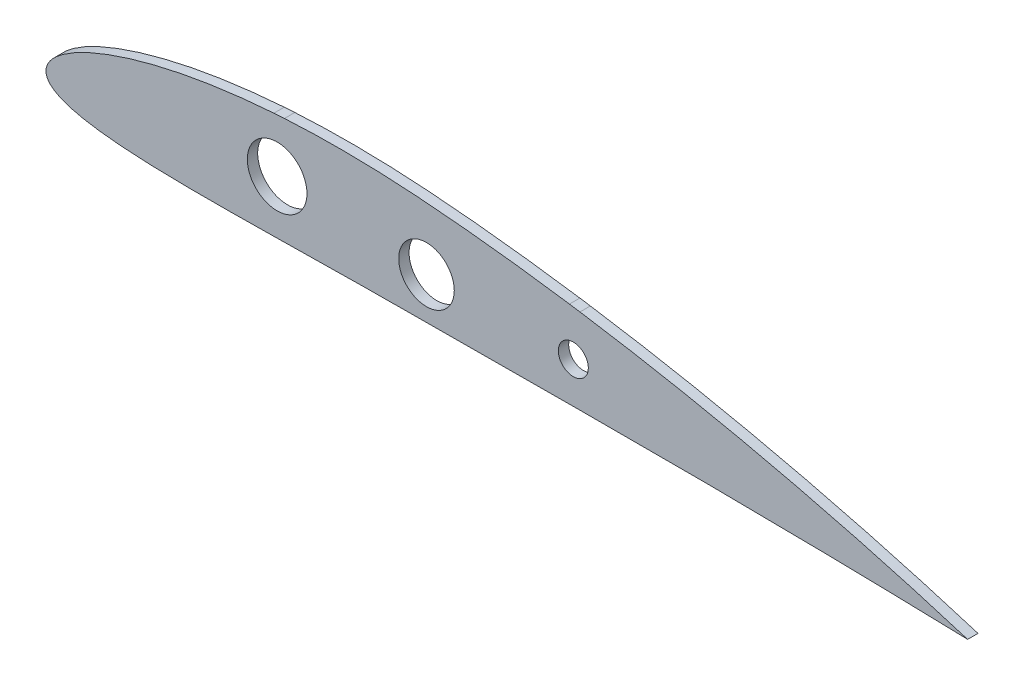
ISO-10303-21;
HEADER;
FILE_DESCRIPTION(('STEP AP214'),'2;1');
FILE_NAME('part.step','',(''),(''),'','','');
FILE_SCHEMA(('AUTOMOTIVE_DESIGN { 1 0 10303 214 1 1 1 1 }'));
ENDSEC;
DATA;
#1=APPLICATION_CONTEXT('core data for automotive mechanical design processes');
#2=APPLICATION_PROTOCOL_DEFINITION('international standard','automotive_design',2000,#1);
#3=PRODUCT_CONTEXT('',#1,'mechanical');
#4=PRODUCT('Part','Part','',(#3));
#5=PRODUCT_RELATED_PRODUCT_CATEGORY('part','',(#4));
#6=PRODUCT_DEFINITION_FORMATION('','',#4);
#7=PRODUCT_DEFINITION_CONTEXT('part definition',#1,'design');
#8=PRODUCT_DEFINITION('design','',#6,#7);
#9=PRODUCT_DEFINITION_SHAPE('','',#8);
#10=(LENGTH_UNIT() NAMED_UNIT(*) SI_UNIT(.MILLI.,.METRE.));
#11=(NAMED_UNIT(*) PLANE_ANGLE_UNIT() SI_UNIT($,.RADIAN.));
#12=(NAMED_UNIT(*) SI_UNIT($,.STERADIAN.) SOLID_ANGLE_UNIT());
#13=UNCERTAINTY_MEASURE_WITH_UNIT(LENGTH_MEASURE(1.E-05),#10,'distance_accuracy_value','');
#14=(GEOMETRIC_REPRESENTATION_CONTEXT(3) GLOBAL_UNCERTAINTY_ASSIGNED_CONTEXT((#13)) GLOBAL_UNIT_ASSIGNED_CONTEXT((#10,
#11,#12)) REPRESENTATION_CONTEXT('',''));
#15=CARTESIAN_POINT('',(0.,0.,0.));
#16=DIRECTION('',(0.,0.,1.));
#17=DIRECTION('',(1.,0.,0.));
#18=AXIS2_PLACEMENT_3D('',#15,#16,#17);
#19=CARTESIAN_POINT('',(149.894619256414,106.854755989877,1.4));
#20=CARTESIAN_POINT('',(158.680275082572,106.889957074756,1.4));
#21=CARTESIAN_POINT('',(176.251614136073,106.916321204518,1.4));
#22=CARTESIAN_POINT('',(202.609661936218,106.73064533298,1.4));
#23=CARTESIAN_POINT('',(228.96468105988,106.292568252224,1.4));
#24=CARTESIAN_POINT('',(246.530526636941,105.850587700062,1.4));
#25=CARTESIAN_POINT('',(255.312881654357,105.60676111473,1.4));
#26=B_SPLINE_CURVE_WITH_KNOTS('',3,(#19,#20,#21,#22,#23,#24,#25),.UNSPECIFIED.,.F.,.F.,(4,1,1,1,
4),(0.581490104405728,0.685469054372265,0.789448004338803,0.89342695430534,0.997405904271877),.UNSPECIFIED.);
#27=DIRECTION('',(0.,0.,-1.));
#28=VECTOR('',#27,1.);
#29=SURFACE_OF_LINEAR_EXTRUSION('',#26,#28);
#30=CARTESIAN_POINT('',(149.894619256414,106.854755989877,-1.4));
#31=CARTESIAN_POINT('',(158.680275082572,106.889957074756,-1.4));
#32=CARTESIAN_POINT('',(176.251614136073,106.916321204518,-1.4));
#33=CARTESIAN_POINT('',(202.609661936218,106.73064533298,-1.4));
#34=CARTESIAN_POINT('',(228.96468105988,106.292568252224,-1.4));
#35=CARTESIAN_POINT('',(246.530526636941,105.850587700062,-1.4));
#36=CARTESIAN_POINT('',(255.312881654357,105.60676111473,-1.4));
#37=B_SPLINE_CURVE_WITH_KNOTS('',3,(#30,#31,#32,#33,#34,#35,#36),.UNSPECIFIED.,.F.,.F.,(4,1,1,1,
4),(0.581490104405728,0.685469054372265,0.789448004338803,0.89342695430534,0.997405904271877),.UNSPECIFIED.);
#38=CARTESIAN_POINT('',(149.894619256414,106.854755989877,-1.4));
#39=VERTEX_POINT('',#38);
#40=CARTESIAN_POINT('',(255.312881654357,105.60676111473,-1.4));
#41=VERTEX_POINT('',#40);
#42=EDGE_CURVE('E299',#39,#41,#37,.T.);
#43=ORIENTED_EDGE('',*,*,#42,.T.);
#44=DIRECTION('',(0.,0.,-1.));
#45=VECTOR('',#44,1.);
#46=CARTESIAN_POINT('',(255.312881654357,105.60676111473,1.4));
#47=LINE('',#46,#45);
#48=CARTESIAN_POINT('',(255.312881654357,105.60676111473,1.4));
#49=VERTEX_POINT('',#48);
#50=EDGE_CURVE('E11',#49,#41,#47,.T.);
#51=ORIENTED_EDGE('',*,*,#50,.F.);
#52=CARTESIAN_POINT('',(149.894619256414,106.854755989877,1.4));
#53=VERTEX_POINT('',#52);
#54=EDGE_CURVE('E226',#53,#49,#26,.T.);
#55=ORIENTED_EDGE('',*,*,#54,.F.);
#56=DIRECTION('',(0.,0.,-1.));
#57=VECTOR('',#56,1.);
#58=CARTESIAN_POINT('',(149.894619256414,106.854755989877,1.4));
#59=LINE('',#58,#57);
#60=EDGE_CURVE('E151',#53,#39,#59,.T.);
#61=ORIENTED_EDGE('',*,*,#60,.T.);
#62=EDGE_LOOP('',(#43,#51,#55,#61));
#63=FACE_BOUND('',#62,.T.);
#64=ADVANCED_FACE('F41',(#63),#29,.F.);
#65=CARTESIAN_POINT('',(255.312881654358,105.60676111473,1.4));
#66=CARTESIAN_POINT('',(246.756257413019,108.260896884076,1.4));
#67=CARTESIAN_POINT('',(229.544442336783,113.256971155101,1.4));
#68=CARTESIAN_POINT('',(203.470240893226,119.799788090141,1.4));
#69=CARTESIAN_POINT('',(177.178570900213,125.404416996228,1.4));
#70=CARTESIAN_POINT('',(159.522198848418,128.478032217995,1.4));
#71=CARTESIAN_POINT('',(150.666396797967,129.829620390135,1.4));
#72=B_SPLINE_CURVE_WITH_KNOTS('',3,(#65,#66,#67,#68,#69,#70,#71),.UNSPECIFIED.,.F.,.F.,(4,1,1,1,
4),(0.00222757964376328,0.106325046268371,0.210422512892978,0.314519979517586,
0.418617446142193),.UNSPECIFIED.);
#73=DIRECTION('',(0.,0.,-1.));
#74=VECTOR('',#73,1.);
#75=SURFACE_OF_LINEAR_EXTRUSION('',#72,#74);
#76=CARTESIAN_POINT('',(255.312881654358,105.60676111473,-1.4));
#77=CARTESIAN_POINT('',(246.756257413019,108.260896884076,-1.4));
#78=CARTESIAN_POINT('',(229.544442336783,113.256971155101,-1.4));
#79=CARTESIAN_POINT('',(203.470240893226,119.799788090141,-1.4));
#80=CARTESIAN_POINT('',(177.178570900213,125.404416996228,-1.4));
#81=CARTESIAN_POINT('',(159.522198848418,128.478032217995,-1.4));
#82=CARTESIAN_POINT('',(150.666396797967,129.829620390135,-1.4));
#83=B_SPLINE_CURVE_WITH_KNOTS('',3,(#76,#77,#78,#79,#80,#81,#82),.UNSPECIFIED.,.F.,.F.,(4,1,1,1,
4),(0.00222757964376328,0.106325046268371,0.210422512892978,0.314519979517586,
0.418617446142193),.UNSPECIFIED.);
#84=CARTESIAN_POINT('',(150.666396797967,129.829620390135,-1.4));
#85=VERTEX_POINT('',#84);
#86=EDGE_CURVE('E290',#41,#85,#83,.T.);
#87=ORIENTED_EDGE('',*,*,#86,.T.);
#88=DIRECTION('',(0.,0.,-1.));
#89=VECTOR('',#88,1.);
#90=CARTESIAN_POINT('',(150.666396797967,129.829620390135,1.4));
#91=LINE('',#90,#89);
#92=CARTESIAN_POINT('',(150.666396797967,129.829620390135,1.4));
#93=VERTEX_POINT('',#92);
#94=EDGE_CURVE('E51',#93,#85,#91,.T.);
#95=ORIENTED_EDGE('',*,*,#94,.F.);
#96=EDGE_CURVE('E108',#49,#93,#72,.T.);
#97=ORIENTED_EDGE('',*,*,#96,.F.);
#98=ORIENTED_EDGE('',*,*,#50,.T.);
#99=EDGE_LOOP('',(#87,#95,#97,#98));
#100=FACE_BOUND('',#99,.T.);
#101=ADVANCED_FACE('F216',(#100),#75,.F.);
#102=CARTESIAN_POINT('',(22.4132301607214,149.108042258836,1.4));
#103=DIRECTION('',(-0.148645447229902,-0.988890555631826,0.));
#104=DIRECTION('',(0.988890555631826,-0.148645447229902,0.));
#105=AXIS2_PLACEMENT_3D('',#102,#103,#104);
#106=PLANE('',#105);
#107=DIRECTION('',(-0.988890555631827,0.148645447229902,0.));
#108=VECTOR('',#107,1.);
#109=CARTESIAN_POINT('',(22.4132301607214,149.108042258836,-1.4));
#110=LINE('',#109,#108);
#111=CARTESIAN_POINT('',(147.830444308927,130.255907630574,-1.4));
#112=VERTEX_POINT('',#111);
#113=EDGE_CURVE('E285',#85,#112,#110,.T.);
#114=ORIENTED_EDGE('',*,*,#113,.T.);
#115=DIRECTION('',(0.,0.,-1.));
#116=VECTOR('',#115,1.);
#117=CARTESIAN_POINT('',(147.830444308927,130.255907630574,1.4));
#118=LINE('',#117,#116);
#119=CARTESIAN_POINT('',(147.830444308927,130.255907630574,1.4));
#120=VERTEX_POINT('',#119);
#121=EDGE_CURVE('E277',#120,#112,#118,.T.);
#122=ORIENTED_EDGE('',*,*,#121,.F.);
#123=DIRECTION('',(-0.988890555631827,0.148645447229902,0.));
#124=VECTOR('',#123,1.);
#125=CARTESIAN_POINT('',(22.4132301607214,149.108042258836,1.4));
#126=LINE('',#125,#124);
#127=EDGE_CURVE('E202',#93,#120,#126,.T.);
#128=ORIENTED_EDGE('',*,*,#127,.F.);
#129=ORIENTED_EDGE('',*,*,#94,.T.);
#130=EDGE_LOOP('',(#114,#122,#128,#129));
#131=FACE_BOUND('',#130,.T.);
#132=ADVANCED_FACE('F212',(#131),#106,.F.);
#133=CARTESIAN_POINT('',(147.830444308927,130.255907630574,1.4));
#134=CARTESIAN_POINT('',(141.461413304013,131.198524365854,1.4));
#135=CARTESIAN_POINT('',(128.693359955302,132.886388705287,1.4));
#136=CARTESIAN_POINT('',(112.670431319553,134.461645248722,1.4));
#137=CARTESIAN_POINT('',(99.8269687406425,135.315000174993,1.4));
#138=CARTESIAN_POINT('',(86.9640203559575,135.731264376099,1.4));
#139=CARTESIAN_POINT('',(77.308341909027,135.549477481378,1.4));
#140=CARTESIAN_POINT('',(70.8877326550715,135.171040435875,1.4));
#141=B_SPLINE_CURVE_WITH_KNOTS('',3,(#133,#134,#135,#136,#137,#138,#139,#140),.UNSPECIFIED.,.F.,
.F.,(4,1,1,1,1,4),(0.429725304294292,0.504544930385916,0.57936455647754,0.616774369523352,
0.654184182569164,0.729003808660788),.UNSPECIFIED.);
#142=DIRECTION('',(0.,0.,-1.));
#143=VECTOR('',#142,1.);
#144=SURFACE_OF_LINEAR_EXTRUSION('',#141,#143);
#145=CARTESIAN_POINT('',(147.830444308927,130.255907630574,-1.4));
#146=CARTESIAN_POINT('',(141.461413304013,131.198524365854,-1.4));
#147=CARTESIAN_POINT('',(128.693359955302,132.886388705287,-1.4));
#148=CARTESIAN_POINT('',(112.670431319553,134.461645248722,-1.4));
#149=CARTESIAN_POINT('',(99.8269687406425,135.315000174993,-1.4));
#150=CARTESIAN_POINT('',(86.9640203559575,135.731264376099,-1.4));
#151=CARTESIAN_POINT('',(77.308341909027,135.549477481378,-1.4));
#152=CARTESIAN_POINT('',(70.8877326550715,135.171040435875,-1.4));
#153=B_SPLINE_CURVE_WITH_KNOTS('',3,(#145,#146,#147,#148,#149,#150,#151,#152),.UNSPECIFIED.,.F.,
.F.,(4,1,1,1,1,4),(0.429725304294292,0.504544930385916,0.57936455647754,0.616774369523352,
0.654184182569164,0.729003808660788),.UNSPECIFIED.);
#154=CARTESIAN_POINT('',(70.8877326550715,135.171040435875,-1.4));
#155=VERTEX_POINT('',#154);
#156=EDGE_CURVE('E292',#112,#155,#153,.T.);
#157=ORIENTED_EDGE('',*,*,#156,.T.);
#158=DIRECTION('',(0.,0.,-1.));
#159=VECTOR('',#158,1.);
#160=CARTESIAN_POINT('',(70.8877326550715,135.171040435875,1.4));
#161=LINE('',#160,#159);
#162=CARTESIAN_POINT('',(70.8877326550715,135.171040435875,1.4));
#163=VERTEX_POINT('',#162);
#164=EDGE_CURVE('E273',#163,#155,#161,.T.);
#165=ORIENTED_EDGE('',*,*,#164,.F.);
#166=EDGE_CURVE('E196',#120,#163,#141,.T.);
#167=ORIENTED_EDGE('',*,*,#166,.F.);
#168=ORIENTED_EDGE('',*,*,#121,.T.);
#169=EDGE_LOOP('',(#157,#165,#167,#168));
#170=FACE_BOUND('',#169,.T.);
#171=ADVANCED_FACE('F208',(#170),#144,.F.);
#172=CARTESIAN_POINT('',(-8.44678797017762,130.016927928256,1.4));
#173=DIRECTION('',(0.06483016250442,-0.99789631226378,0.));
#174=DIRECTION('',(0.99789631226378,0.06483016250442,0.));
#175=AXIS2_PLACEMENT_3D('',#172,#173,#174);
#176=PLANE('',#175);
#177=DIRECTION('',(-0.99789631226378,-0.06483016250442,0.));
#178=VECTOR('',#177,1.);
#179=CARTESIAN_POINT('',(-8.44678797017762,130.016927928256,-1.4));
#180=LINE('',#179,#178);
#181=CARTESIAN_POINT('',(68.0343243508861,134.985663536714,-1.4));
#182=VERTEX_POINT('',#181);
#183=EDGE_CURVE('E297',#155,#182,#180,.T.);
#184=ORIENTED_EDGE('',*,*,#183,.T.);
#185=DIRECTION('',(0.,0.,-1.));
#186=VECTOR('',#185,1.);
#187=CARTESIAN_POINT('',(68.0343243508861,134.985663536714,1.4));
#188=LINE('',#187,#186);
#189=CARTESIAN_POINT('',(68.0343243508861,134.985663536714,1.4));
#190=VERTEX_POINT('',#189);
#191=EDGE_CURVE('E269',#190,#182,#188,.T.);
#192=ORIENTED_EDGE('',*,*,#191,.F.);
#193=DIRECTION('',(-0.99789631226378,-0.06483016250442,0.));
#194=VECTOR('',#193,1.);
#195=CARTESIAN_POINT('',(-8.44678797017762,130.016927928256,1.4));
#196=LINE('',#195,#194);
#197=EDGE_CURVE('E190',#163,#190,#196,.T.);
#198=ORIENTED_EDGE('',*,*,#197,.F.);
#199=ORIENTED_EDGE('',*,*,#164,.T.);
#200=EDGE_LOOP('',(#184,#192,#198,#199));
#201=FACE_BOUND('',#200,.T.);
#202=ADVANCED_FACE('F211',(#201),#176,.F.);
#203=CARTESIAN_POINT('',(68.0343243508861,134.985663536714,1.4));
#204=CARTESIAN_POINT('',(62.4663272915128,134.590052618776,1.4));
#205=CARTESIAN_POINT('',(54.1287667732198,133.700155230356,1.4));
#206=CARTESIAN_POINT('',(43.125220572952,131.802909903816,1.4));
#207=CARTESIAN_POINT('',(34.9537761482906,129.977054103772,1.4));
#208=CARTESIAN_POINT('',(26.9071914758097,127.675989274361,1.4));
#209=CARTESIAN_POINT('',(20.3679809041667,125.262128548987,1.4));
#210=CARTESIAN_POINT('',(15.3365499347751,122.888373262699,1.4));
#211=CARTESIAN_POINT('',(11.7395607910426,120.808049658938,1.4));
#212=CARTESIAN_POINT('',(8.99153245879158,118.69641057424,1.4));
#213=CARTESIAN_POINT('',(7.48174934294299,116.88622792471,1.4));
#214=CARTESIAN_POINT('',(6.915411804354,115.858161553268,1.4));
#215=CARTESIAN_POINT('',(6.7078970409493,115.274334725607,1.4));
#216=CARTESIAN_POINT('',(6.62545754213481,114.936901914895,1.4));
#217=CARTESIAN_POINT('',(6.58542850054553,114.772902260157,1.4));
#218=B_SPLINE_CURVE_WITH_KNOTS('',3,(#203,#204,#205,#206,#207,#208,#209,#210,#211,#212,#213,
#214,#215,#216,#217),.UNSPECIFIED.,.F.,.F.,(4,1,1,1,1,1,1,1,1,1,1,1,4),(0.740090669371658,
0.805048089327921,0.837526799306053,0.870005509284185,0.902484219262317,0.934962929240448,
0.951202284229514,0.96744163921858,0.983680994207646,0.991800671702179,0.995860510449445,
0.997890429823078,0.999920349196711),.UNSPECIFIED.);
#219=DIRECTION('',(0.,0.,-1.));
#220=VECTOR('',#219,1.);
#221=SURFACE_OF_LINEAR_EXTRUSION('',#218,#220);
#222=CARTESIAN_POINT('',(68.0343243508861,134.985663536714,-1.4));
#223=CARTESIAN_POINT('',(62.4663272915128,134.590052618776,-1.4));
#224=CARTESIAN_POINT('',(54.1287667732198,133.700155230356,-1.4));
#225=CARTESIAN_POINT('',(43.125220572952,131.802909903816,-1.4));
#226=CARTESIAN_POINT('',(34.9537761482906,129.977054103772,-1.4));
#227=CARTESIAN_POINT('',(26.9071914758097,127.675989274361,-1.4));
#228=CARTESIAN_POINT('',(20.3679809041667,125.262128548987,-1.4));
#229=CARTESIAN_POINT('',(15.3365499347751,122.888373262699,-1.4));
#230=CARTESIAN_POINT('',(11.7395607910426,120.808049658938,-1.4));
#231=CARTESIAN_POINT('',(8.99153245879158,118.69641057424,-1.4));
#232=CARTESIAN_POINT('',(7.48174934294299,116.88622792471,-1.4));
#233=CARTESIAN_POINT('',(6.915411804354,115.858161553268,-1.4));
#234=CARTESIAN_POINT('',(6.7078970409493,115.274334725607,-1.4));
#235=CARTESIAN_POINT('',(6.62545754213481,114.936901914895,-1.4));
#236=CARTESIAN_POINT('',(6.58542850054553,114.772902260157,-1.4));
#237=B_SPLINE_CURVE_WITH_KNOTS('',3,(#222,#223,#224,#225,#226,#227,#228,#229,#230,#231,#232,
#233,#234,#235,#236),.UNSPECIFIED.,.F.,.F.,(4,1,1,1,1,1,1,1,1,1,1,1,4),(0.740090669371658,
0.805048089327921,0.837526799306053,0.870005509284185,0.902484219262317,0.934962929240448,
0.951202284229514,0.96744163921858,0.983680994207646,0.991800671702179,0.995860510449445,
0.997890429823078,0.999920349196711),.UNSPECIFIED.);
#238=CARTESIAN_POINT('',(6.58542850054553,114.772902260157,-1.4));
#239=VERTEX_POINT('',#238);
#240=EDGE_CURVE('E312',#182,#239,#237,.T.);
#241=ORIENTED_EDGE('',*,*,#240,.T.);
#242=DIRECTION('',(0.,0.,-1.));
#243=VECTOR('',#242,1.);
#244=CARTESIAN_POINT('',(6.58542850054553,114.772902260157,1.4));
#245=LINE('',#244,#243);
#246=CARTESIAN_POINT('',(6.58542850054553,114.772902260157,1.4));
#247=VERTEX_POINT('',#246);
#248=EDGE_CURVE('E265',#247,#239,#245,.T.);
#249=ORIENTED_EDGE('',*,*,#248,.F.);
#250=EDGE_CURVE('E181',#190,#247,#218,.T.);
#251=ORIENTED_EDGE('',*,*,#250,.F.);
#252=ORIENTED_EDGE('',*,*,#191,.T.);
#253=EDGE_LOOP('',(#241,#249,#251,#252));
#254=FACE_BOUND('',#253,.T.);
#255=ADVANCED_FACE('F173',(#254),#221,.F.);
#256=CARTESIAN_POINT('',(6.58542850054553,114.772902260157,1.4));
#257=CARTESIAN_POINT('',(6.56366414620477,114.614273347557,1.4));
#258=CARTESIAN_POINT('',(6.5190093469714,114.285406452402,1.4));
#259=CARTESIAN_POINT('',(6.51479072954578,113.710879009962,1.4));
#260=CARTESIAN_POINT('',(6.74189878291116,112.661535218991,1.4));
#261=CARTESIAN_POINT('',(7.66018429255603,111.409854012936,1.4));
#262=CARTESIAN_POINT('',(9.25908473021288,110.308268876171,1.4));
#263=CARTESIAN_POINT('',(11.044608156902,109.487380203342,1.4));
#264=CARTESIAN_POINT('',(12.9221944408203,108.850067693768,1.4));
#265=CARTESIAN_POINT('',(15.4901264572917,108.172753601497,1.4));
#266=CARTESIAN_POINT('',(18.7685029621804,107.558568006788,1.4));
#267=CARTESIAN_POINT('',(22.7454433758667,107.043168293996,1.4));
#268=CARTESIAN_POINT('',(28.0773130031014,106.557350361525,1.4));
#269=CARTESIAN_POINT('',(34.769590400056,106.213470374942,1.4));
#270=CARTESIAN_POINT('',(42.813490810935,106.037235573254,1.4));
#271=CARTESIAN_POINT('',(50.8626774800394,106.006056339145,1.4));
#272=CARTESIAN_POINT('',(58.9136155720875,106.062256394151,1.4));
#273=CARTESIAN_POINT('',(64.2820421930946,106.132538160557,1.4));
#274=CARTESIAN_POINT('',(66.9660117195889,106.171159396513,1.4));
#275=B_SPLINE_CURVE_WITH_KNOTS('',3,(#256,#257,#258,#259,#260,#261,#262,#263,#264,#265,#266,
#267,#268,#269,#270,#271,#272,#273,#274),.UNSPECIFIED.,.F.,.F.,(4,1,1,1,1,1,1,1,1,1,1,1,1,1,1,1,
4),(8.11675194704331E-05,0.00206730045466935,0.00405343338986826,0.00802569926026608,
0.0159702310010617,0.0239147627418574,0.031859294482653,0.0398038262234487,0.0477483579642443,
0.0636374214458356,0.0795264849274269,0.0954155484090183,0.127193675372201,0.158971802335383,
0.190749929298566,0.222528056261749,0.254306183224931),.UNSPECIFIED.);
#276=DIRECTION('',(0.,0.,-1.));
#277=VECTOR('',#276,1.);
#278=SURFACE_OF_LINEAR_EXTRUSION('',#275,#277);
#279=CARTESIAN_POINT('',(6.58542850054553,114.772902260157,-1.4));
#280=CARTESIAN_POINT('',(6.56366414620477,114.614273347557,-1.4));
#281=CARTESIAN_POINT('',(6.5190093469714,114.285406452402,-1.4));
#282=CARTESIAN_POINT('',(6.51479072954578,113.710879009962,-1.4));
#283=CARTESIAN_POINT('',(6.74189878291116,112.661535218991,-1.4));
#284=CARTESIAN_POINT('',(7.66018429255603,111.409854012936,-1.4));
#285=CARTESIAN_POINT('',(9.25908473021288,110.308268876171,-1.4));
#286=CARTESIAN_POINT('',(11.044608156902,109.487380203342,-1.4));
#287=CARTESIAN_POINT('',(12.9221944408203,108.850067693768,-1.4));
#288=CARTESIAN_POINT('',(15.4901264572917,108.172753601497,-1.4));
#289=CARTESIAN_POINT('',(18.7685029621804,107.558568006788,-1.4));
#290=CARTESIAN_POINT('',(22.7454433758667,107.043168293996,-1.4));
#291=CARTESIAN_POINT('',(28.0773130031014,106.557350361525,-1.4));
#292=CARTESIAN_POINT('',(34.769590400056,106.213470374942,-1.4));
#293=CARTESIAN_POINT('',(42.813490810935,106.037235573254,-1.4));
#294=CARTESIAN_POINT('',(50.8626774800394,106.006056339145,-1.4));
#295=CARTESIAN_POINT('',(58.9136155720875,106.062256394151,-1.4));
#296=CARTESIAN_POINT('',(64.2820421930946,106.132538160557,-1.4));
#297=CARTESIAN_POINT('',(66.9660117195889,106.171159396513,-1.4));
#298=B_SPLINE_CURVE_WITH_KNOTS('',3,(#279,#280,#281,#282,#283,#284,#285,#286,#287,#288,#289,
#290,#291,#292,#293,#294,#295,#296,#297),.UNSPECIFIED.,.F.,.F.,(4,1,1,1,1,1,1,1,1,1,1,1,1,1,1,1,
4),(8.11675194704331E-05,0.00206730045466935,0.00405343338986826,0.00802569926026608,
0.0159702310010617,0.0239147627418574,0.031859294482653,0.0398038262234487,0.0477483579642443,
0.0636374214458356,0.0795264849274269,0.0954155484090183,0.127193675372201,0.158971802335383,
0.190749929298566,0.222528056261749,0.254306183224931),.UNSPECIFIED.);
#299=CARTESIAN_POINT('',(66.9660117195889,106.171159396513,-1.4));
#300=VERTEX_POINT('',#299);
#301=EDGE_CURVE('E317',#239,#300,#298,.T.);
#302=ORIENTED_EDGE('',*,*,#301,.T.);
#303=DIRECTION('',(0.,0.,-1.));
#304=VECTOR('',#303,1.);
#305=CARTESIAN_POINT('',(66.9660117195889,106.171159396513,1.4));
#306=LINE('',#305,#304);
#307=CARTESIAN_POINT('',(66.9660117195889,106.171159396513,1.4));
#308=VERTEX_POINT('',#307);
#309=EDGE_CURVE('E144',#308,#300,#306,.T.);
#310=ORIENTED_EDGE('',*,*,#309,.F.);
#311=EDGE_CURVE('E133',#247,#308,#275,.T.);
#312=ORIENTED_EDGE('',*,*,#311,.F.);
#313=ORIENTED_EDGE('',*,*,#248,.T.);
#314=EDGE_LOOP('',(#302,#310,#312,#313));
#315=FACE_BOUND('',#314,.T.);
#316=ADVANCED_FACE('F170',(#315),#278,.F.);
#317=CARTESIAN_POINT('',(-1.55725848249838,105.156400011837,1.4));
#318=DIRECTION('',(-0.0148073512648334,0.999890365164361,0.));
#319=DIRECTION('',(-0.999890365164361,-0.0148073512648334,0.));
#320=AXIS2_PLACEMENT_3D('',#317,#318,#319);
#321=PLANE('',#320);
#322=DIRECTION('',(0.999890365164361,0.0148073512648334,0.));
#323=VECTOR('',#322,1.);
#324=CARTESIAN_POINT('',(-1.55725848249838,105.156400011837,-1.4));
#325=LINE('',#324,#323);
#326=CARTESIAN_POINT('',(69.8190690071352,106.213410250114,-1.4));
#327=VERTEX_POINT('',#326);
#328=EDGE_CURVE('E142',#300,#327,#325,.T.);
#329=ORIENTED_EDGE('',*,*,#328,.T.);
#330=DIRECTION('',(0.,0.,-1.));
#331=VECTOR('',#330,1.);
#332=CARTESIAN_POINT('',(69.8190690071352,106.213410250114,1.4));
#333=LINE('',#332,#331);
#334=CARTESIAN_POINT('',(69.8190690071352,106.213410250114,1.4));
#335=VERTEX_POINT('',#334);
#336=EDGE_CURVE('E139',#335,#327,#333,.T.);
#337=ORIENTED_EDGE('',*,*,#336,.F.);
#338=DIRECTION('',(0.999890365164361,0.0148073512648334,0.));
#339=VECTOR('',#338,1.);
#340=CARTESIAN_POINT('',(-1.55725848249838,105.156400011837,1.4));
#341=LINE('',#340,#339);
#342=EDGE_CURVE('E127',#308,#335,#341,.T.);
#343=ORIENTED_EDGE('',*,*,#342,.F.);
#344=ORIENTED_EDGE('',*,*,#309,.T.);
#345=EDGE_LOOP('',(#329,#337,#343,#344));
#346=FACE_BOUND('',#345,.T.);
#347=ADVANCED_FACE('F140',(#346),#321,.F.);
#348=CARTESIAN_POINT('',(69.8190690071352,106.213410250114,1.4));
#349=CARTESIAN_POINT('',(76.2538567327048,106.31100684137,1.4));
#350=CARTESIAN_POINT('',(85.9047948489214,106.47213737338,1.4));
#351=CARTESIAN_POINT('',(98.7779456737836,106.610759511662,1.4));
#352=CARTESIAN_POINT('',(111.651100899515,106.649514986469,1.4));
#353=CARTESIAN_POINT('',(127.735402572152,106.732475133212,1.4));
#354=CARTESIAN_POINT('',(140.606952956768,106.813706415112,1.4));
#355=CARTESIAN_POINT('',(147.042263767006,106.842620089855,1.4));
#356=B_SPLINE_CURVE_WITH_KNOTS('',3,(#348,#349,#350,#351,#352,#353,#354,#355),.UNSPECIFIED.,.F.,
.F.,(4,1,1,1,1,4),(0.265565078046195,0.341733084566208,0.379817087826214,0.41790109108622,
0.494069097606233,0.570237104126246),.UNSPECIFIED.);
#357=DIRECTION('',(0.,0.,-1.));
#358=VECTOR('',#357,1.);
#359=SURFACE_OF_LINEAR_EXTRUSION('',#356,#358);
#360=CARTESIAN_POINT('',(69.8190690071352,106.213410250114,-1.4));
#361=CARTESIAN_POINT('',(76.2538567327048,106.31100684137,-1.4));
#362=CARTESIAN_POINT('',(85.9047948489214,106.47213737338,-1.4));
#363=CARTESIAN_POINT('',(98.7779456737836,106.610759511662,-1.4));
#364=CARTESIAN_POINT('',(111.651100899515,106.649514986469,-1.4));
#365=CARTESIAN_POINT('',(127.735402572152,106.732475133212,-1.4));
#366=CARTESIAN_POINT('',(140.606952956768,106.813706415112,-1.4));
#367=CARTESIAN_POINT('',(147.042263767006,106.842620089855,-1.4));
#368=B_SPLINE_CURVE_WITH_KNOTS('',3,(#360,#361,#362,#363,#364,#365,#366,#367),.UNSPECIFIED.,.F.,
.F.,(4,1,1,1,1,4),(0.265565078046195,0.341733084566208,0.379817087826214,0.41790109108622,
0.494069097606233,0.570237104126246),.UNSPECIFIED.);
#369=CARTESIAN_POINT('',(147.042263767006,106.842620089855,-1.4));
#370=VERTEX_POINT('',#369);
#371=EDGE_CURVE('E94',#327,#370,#368,.T.);
#372=ORIENTED_EDGE('',*,*,#371,.T.);
#373=DIRECTION('',(0.,0.,-1.));
#374=VECTOR('',#373,1.);
#375=CARTESIAN_POINT('',(147.042263767006,106.842620089855,1.4));
#376=LINE('',#375,#374);
#377=CARTESIAN_POINT('',(147.042263767006,106.842620089855,1.4));
#378=VERTEX_POINT('',#377);
#379=EDGE_CURVE('E145',#378,#370,#376,.T.);
#380=ORIENTED_EDGE('',*,*,#379,.F.);
#381=EDGE_CURVE('E131',#335,#378,#356,.T.);
#382=ORIENTED_EDGE('',*,*,#381,.F.);
#383=ORIENTED_EDGE('',*,*,#336,.T.);
#384=EDGE_LOOP('',(#372,#380,#382,#383));
#385=FACE_BOUND('',#384,.T.);
#386=ADVANCED_FACE('F147',(#385),#359,.F.);
#387=CARTESIAN_POINT('',(68.9168426026147,120.636945020621,1.4));
#388=DIRECTION('',(0.,0.,-1.));
#389=DIRECTION('',(-1.,0.,0.));
#390=AXIS2_PLACEMENT_3D('',#387,#388,#389);
#391=CYLINDRICAL_SURFACE('',#390,8.05);
#392=CARTESIAN_POINT('',(68.9168426026147,120.636945020621,1.4));
#393=DIRECTION('',(0.,0.,1.));
#394=DIRECTION('',(1.,0.,0.));
#395=AXIS2_PLACEMENT_3D('',#392,#393,#394);
#396=CIRCLE('',#395,8.05);
#397=CARTESIAN_POINT('',(76.9668426026146,120.636945020621,1.4));
#398=VERTEX_POINT('',#397);
#399=EDGE_CURVE('E235',#398,#398,#396,.T.);
#400=ORIENTED_EDGE('',*,*,#399,.T.);
#401=EDGE_LOOP('',(#400));
#402=FACE_BOUND('',#401,.T.);
#403=CARTESIAN_POINT('',(68.9168426026147,120.636945020621,-1.4));
#404=DIRECTION('',(0.,0.,1.));
#405=DIRECTION('',(1.,0.,0.));
#406=AXIS2_PLACEMENT_3D('',#403,#404,#405);
#407=CIRCLE('',#406,8.05);
#408=CARTESIAN_POINT('',(76.9668426026146,120.636945020621,-1.4));
#409=VERTEX_POINT('',#408);
#410=EDGE_CURVE('E335',#409,#409,#407,.T.);
#411=ORIENTED_EDGE('',*,*,#410,.F.);
#412=EDGE_LOOP('',(#411));
#413=FACE_BOUND('',#412,.T.);
#414=ADVANCED_FACE('F165',(#402,#413),#391,.F.);
#415=CARTESIAN_POINT('',(109.232573951072,117.844985284419,1.4));
#416=DIRECTION('',(0.,0.,-1.));
#417=DIRECTION('',(-1.,0.,0.));
#418=AXIS2_PLACEMENT_3D('',#415,#416,#417);
#419=CYLINDRICAL_SURFACE('',#418,7.50000000000001);
#420=CARTESIAN_POINT('',(109.232573951072,117.844985284419,1.4));
#421=DIRECTION('',(0.,0.,1.));
#422=DIRECTION('',(1.,0.,0.));
#423=AXIS2_PLACEMENT_3D('',#420,#421,#422);
#424=CIRCLE('',#423,7.50000000000001);
#425=CARTESIAN_POINT('',(116.732573951072,117.844985284419,1.4));
#426=VERTEX_POINT('',#425);
#427=EDGE_CURVE('E242',#426,#426,#424,.T.);
#428=ORIENTED_EDGE('',*,*,#427,.T.);
#429=EDGE_LOOP('',(#428));
#430=FACE_BOUND('',#429,.T.);
#431=CARTESIAN_POINT('',(109.232573951072,117.844985284419,-1.4));
#432=DIRECTION('',(0.,0.,1.));
#433=DIRECTION('',(1.,0.,0.));
#434=AXIS2_PLACEMENT_3D('',#431,#432,#433);
#435=CIRCLE('',#434,7.50000000000001);
#436=CARTESIAN_POINT('',(116.732573951072,117.844985284419,-1.4));
#437=VERTEX_POINT('',#436);
#438=EDGE_CURVE('E338',#437,#437,#435,.T.);
#439=ORIENTED_EDGE('',*,*,#438,.F.);
#440=EDGE_LOOP('',(#439));
#441=FACE_BOUND('',#440,.T.);
#442=ADVANCED_FACE('F356',(#430,#441),#419,.F.);
#443=CARTESIAN_POINT('',(148.868108764142,117.844985284419,1.4));
#444=DIRECTION('',(0.,0.,-1.));
#445=DIRECTION('',(-1.,0.,0.));
#446=AXIS2_PLACEMENT_3D('',#443,#444,#445);
#447=CYLINDRICAL_SURFACE('',#446,4.04999999999999);
#448=CARTESIAN_POINT('',(148.868108764142,117.844985284419,1.4));
#449=DIRECTION('',(0.,0.,1.));
#450=DIRECTION('',(1.,0.,0.));
#451=AXIS2_PLACEMENT_3D('',#448,#449,#450);
#452=CIRCLE('',#451,4.04999999999999);
#453=CARTESIAN_POINT('',(152.918108764142,117.844985284419,1.4));
#454=VERTEX_POINT('',#453);
#455=EDGE_CURVE('E246',#454,#454,#452,.T.);
#456=ORIENTED_EDGE('',*,*,#455,.T.);
#457=EDGE_LOOP('',(#456));
#458=FACE_BOUND('',#457,.T.);
#459=CARTESIAN_POINT('',(148.868108764142,117.844985284419,-1.4));
#460=DIRECTION('',(0.,0.,1.));
#461=DIRECTION('',(1.,0.,0.));
#462=AXIS2_PLACEMENT_3D('',#459,#460,#461);
#463=CIRCLE('',#462,4.04999999999999);
#464=CARTESIAN_POINT('',(152.918108764142,117.844985284419,-1.4));
#465=VERTEX_POINT('',#464);
#466=EDGE_CURVE('E348',#465,#465,#463,.T.);
#467=ORIENTED_EDGE('',*,*,#466,.F.);
#468=EDGE_LOOP('',(#467));
#469=FACE_BOUND('',#468,.T.);
#470=ADVANCED_FACE('F43',(#458,#469),#447,.F.);
#471=CARTESIAN_POINT('',(-0.451912661683315,106.215077490182,1.4));
#472=DIRECTION('',(-0.00425465557301717,0.999990948912016,0.));
#473=DIRECTION('',(-0.999990948912016,-0.00425465557301717,0.));
#474=AXIS2_PLACEMENT_3D('',#471,#472,#473);
#475=PLANE('',#474);
#476=DIRECTION('',(0.999990948912017,0.00425465557301717,0.));
#477=VECTOR('',#476,1.);
#478=CARTESIAN_POINT('',(-0.451912661683315,106.215077490182,-1.4));
#479=LINE('',#478,#477);
#480=EDGE_CURVE('E100',#370,#39,#479,.T.);
#481=ORIENTED_EDGE('',*,*,#480,.T.);
#482=ORIENTED_EDGE('',*,*,#60,.F.);
#483=DIRECTION('',(0.999990948912017,0.00425465557301717,0.));
#484=VECTOR('',#483,1.);
#485=CARTESIAN_POINT('',(-0.451912661683315,106.215077490182,1.4));
#486=LINE('',#485,#484);
#487=EDGE_CURVE('E59',#378,#53,#486,.T.);
#488=ORIENTED_EDGE('',*,*,#487,.F.);
#489=ORIENTED_EDGE('',*,*,#379,.T.);
#490=EDGE_LOOP('',(#481,#482,#488,#489));
#491=FACE_BOUND('',#490,.T.);
#492=ADVANCED_FACE('F166',(#491),#475,.F.);
#493=CARTESIAN_POINT('',(0.,0.,1.4));
#494=DIRECTION('',(0.,0.,1.));
#495=DIRECTION('',(1.,0.,0.));
#496=AXIS2_PLACEMENT_3D('',#493,#494,#495);
#497=PLANE('',#496);
#498=ORIENTED_EDGE('',*,*,#455,.F.);
#499=EDGE_LOOP('',(#498));
#500=FACE_BOUND('',#499,.T.);
#501=ORIENTED_EDGE('',*,*,#427,.F.);
#502=EDGE_LOOP('',(#501));
#503=FACE_BOUND('',#502,.T.);
#504=ORIENTED_EDGE('',*,*,#399,.F.);
#505=EDGE_LOOP('',(#504));
#506=FACE_BOUND('',#505,.T.);
#507=ORIENTED_EDGE('',*,*,#54,.T.);
#508=ORIENTED_EDGE('',*,*,#96,.T.);
#509=ORIENTED_EDGE('',*,*,#127,.T.);
#510=ORIENTED_EDGE('',*,*,#166,.T.);
#511=ORIENTED_EDGE('',*,*,#197,.T.);
#512=ORIENTED_EDGE('',*,*,#250,.T.);
#513=ORIENTED_EDGE('',*,*,#311,.T.);
#514=ORIENTED_EDGE('',*,*,#342,.T.);
#515=ORIENTED_EDGE('',*,*,#381,.T.);
#516=ORIENTED_EDGE('',*,*,#487,.T.);
#517=EDGE_LOOP('',(#507,#508,#509,#510,#511,#512,#513,#514,#515,#516));
#518=FACE_BOUND('',#517,.T.);
#519=ADVANCED_FACE('F129',(#500,#503,#506,#518),#497,.T.);
#520=CARTESIAN_POINT('',(0.,0.,-1.4));
#521=DIRECTION('',(0.,0.,1.));
#522=DIRECTION('',(1.,0.,0.));
#523=AXIS2_PLACEMENT_3D('',#520,#521,#522);
#524=PLANE('',#523);
#525=ORIENTED_EDGE('',*,*,#466,.T.);
#526=EDGE_LOOP('',(#525));
#527=FACE_BOUND('',#526,.T.);
#528=ORIENTED_EDGE('',*,*,#438,.T.);
#529=EDGE_LOOP('',(#528));
#530=FACE_BOUND('',#529,.T.);
#531=ORIENTED_EDGE('',*,*,#410,.T.);
#532=EDGE_LOOP('',(#531));
#533=FACE_BOUND('',#532,.T.);
#534=ORIENTED_EDGE('',*,*,#42,.F.);
#535=ORIENTED_EDGE('',*,*,#480,.F.);
#536=ORIENTED_EDGE('',*,*,#371,.F.);
#537=ORIENTED_EDGE('',*,*,#328,.F.);
#538=ORIENTED_EDGE('',*,*,#301,.F.);
#539=ORIENTED_EDGE('',*,*,#240,.F.);
#540=ORIENTED_EDGE('',*,*,#183,.F.);
#541=ORIENTED_EDGE('',*,*,#156,.F.);
#542=ORIENTED_EDGE('',*,*,#113,.F.);
#543=ORIENTED_EDGE('',*,*,#86,.F.);
#544=EDGE_LOOP('',(#534,#535,#536,#537,#538,#539,#540,#541,#542,#543));
#545=FACE_BOUND('',#544,.T.);
#546=ADVANCED_FACE('F289',(#527,#530,#533,#545),#524,.F.);
#547=CLOSED_SHELL('',(#64,#101,#132,#171,#202,#255,#316,#347,#386,#414,#442,#470,#492,#519,#546));
#548=MANIFOLD_SOLID_BREP('B2',#547);
#549=ADVANCED_BREP_SHAPE_REPRESENTATION('',(#18,#548),#14);
#550=SHAPE_DEFINITION_REPRESENTATION(#9,#549);
ENDSEC;
END-ISO-10303-21;
